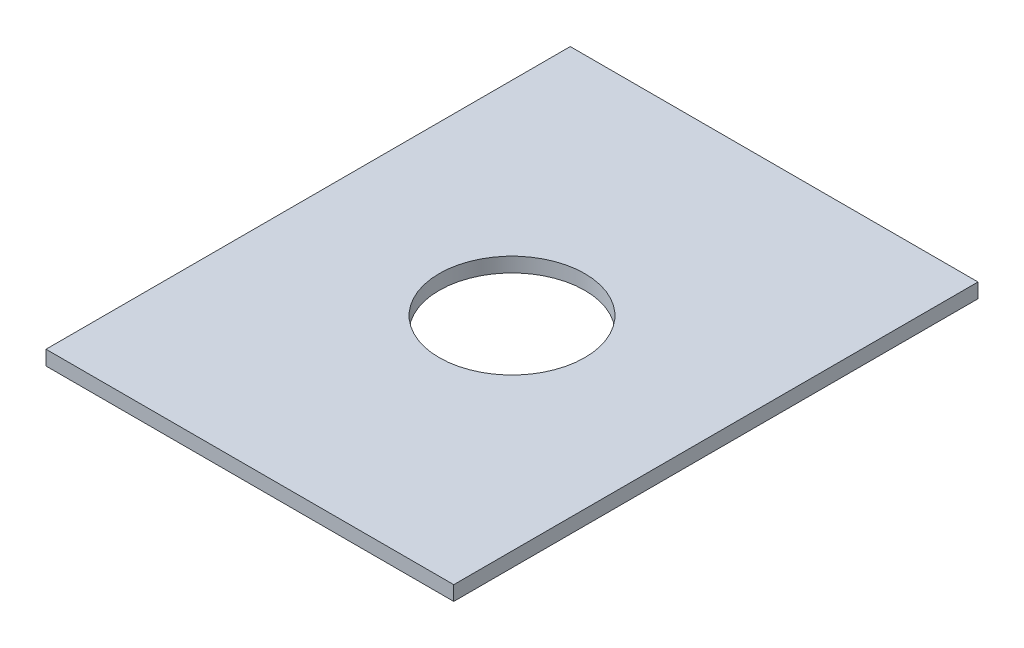
ISO-10303-21;
HEADER;
FILE_DESCRIPTION(('STEP AP214'),'2;1');
FILE_NAME('part.step','',(''),(''),'','','');
FILE_SCHEMA(('AUTOMOTIVE_DESIGN { 1 0 10303 214 1 1 1 1 }'));
ENDSEC;
DATA;
#1=APPLICATION_CONTEXT('core data for automotive mechanical design processes');
#2=APPLICATION_PROTOCOL_DEFINITION('international standard','automotive_design',2000,#1);
#3=PRODUCT_CONTEXT('',#1,'mechanical');
#4=PRODUCT('Part','Part','',(#3));
#5=PRODUCT_RELATED_PRODUCT_CATEGORY('part','',(#4));
#6=PRODUCT_DEFINITION_FORMATION('','',#4);
#7=PRODUCT_DEFINITION_CONTEXT('part definition',#1,'design');
#8=PRODUCT_DEFINITION('design','',#6,#7);
#9=PRODUCT_DEFINITION_SHAPE('','',#8);
#10=(LENGTH_UNIT() NAMED_UNIT(*) SI_UNIT(.MILLI.,.METRE.));
#11=(NAMED_UNIT(*) PLANE_ANGLE_UNIT() SI_UNIT($,.RADIAN.));
#12=(NAMED_UNIT(*) SI_UNIT($,.STERADIAN.) SOLID_ANGLE_UNIT());
#13=UNCERTAINTY_MEASURE_WITH_UNIT(LENGTH_MEASURE(1.E-05),#10,'distance_accuracy_value','');
#14=(GEOMETRIC_REPRESENTATION_CONTEXT(3) GLOBAL_UNCERTAINTY_ASSIGNED_CONTEXT((#13)) GLOBAL_UNIT_ASSIGNED_CONTEXT((#10,
#11,#12)) REPRESENTATION_CONTEXT('',''));
#15=CARTESIAN_POINT('',(0.,0.,0.));
#16=DIRECTION('',(0.,0.,1.));
#17=DIRECTION('',(1.,0.,0.));
#18=AXIS2_PLACEMENT_3D('',#15,#16,#17);
#19=CARTESIAN_POINT('',(70.,5.,-90.));
#20=DIRECTION('',(-1.,0.,0.));
#21=DIRECTION('',(0.,0.,1.));
#22=AXIS2_PLACEMENT_3D('',#19,#20,#21);
#23=PLANE('',#22);
#24=DIRECTION('',(0.,0.,-1.));
#25=VECTOR('',#24,1.);
#26=CARTESIAN_POINT('',(70.,0.,-90.));
#27=LINE('',#26,#25);
#28=CARTESIAN_POINT('',(70.,0.,90.));
#29=VERTEX_POINT('',#28);
#30=CARTESIAN_POINT('',(70.,0.,-90.));
#31=VERTEX_POINT('',#30);
#32=EDGE_CURVE('E115',#29,#31,#27,.T.);
#33=ORIENTED_EDGE('',*,*,#32,.T.);
#34=DIRECTION('',(0.,-1.,0.));
#35=VECTOR('',#34,1.);
#36=CARTESIAN_POINT('',(70.,5.,-90.));
#37=LINE('',#36,#35);
#38=CARTESIAN_POINT('',(70.,5.,-90.));
#39=VERTEX_POINT('',#38);
#40=EDGE_CURVE('E11',#39,#31,#37,.T.);
#41=ORIENTED_EDGE('',*,*,#40,.F.);
#42=DIRECTION('',(0.,0.,-1.));
#43=VECTOR('',#42,1.);
#44=CARTESIAN_POINT('',(70.,5.,-90.));
#45=LINE('',#44,#43);
#46=CARTESIAN_POINT('',(70.,5.,90.));
#47=VERTEX_POINT('',#46);
#48=EDGE_CURVE('E96',#47,#39,#45,.T.);
#49=ORIENTED_EDGE('',*,*,#48,.F.);
#50=DIRECTION('',(0.,-1.,0.));
#51=VECTOR('',#50,1.);
#52=CARTESIAN_POINT('',(70.,5.,90.));
#53=LINE('',#52,#51);
#54=EDGE_CURVE('E107',#47,#29,#53,.T.);
#55=ORIENTED_EDGE('',*,*,#54,.T.);
#56=EDGE_LOOP('',(#33,#41,#49,#55));
#57=FACE_BOUND('',#56,.T.);
#58=ADVANCED_FACE('F42',(#57),#23,.F.);
#59=CARTESIAN_POINT('',(-70.,5.,-90.));
#60=DIRECTION('',(0.,0.,1.));
#61=DIRECTION('',(1.,0.,0.));
#62=AXIS2_PLACEMENT_3D('',#59,#60,#61);
#63=PLANE('',#62);
#64=DIRECTION('',(-1.,0.,0.));
#65=VECTOR('',#64,1.);
#66=CARTESIAN_POINT('',(-70.,0.,-90.));
#67=LINE('',#66,#65);
#68=CARTESIAN_POINT('',(-70.,0.,-90.));
#69=VERTEX_POINT('',#68);
#70=EDGE_CURVE('E101',#31,#69,#67,.T.);
#71=ORIENTED_EDGE('',*,*,#70,.T.);
#72=DIRECTION('',(0.,-1.,0.));
#73=VECTOR('',#72,1.);
#74=CARTESIAN_POINT('',(-70.,5.,-90.));
#75=LINE('',#74,#73);
#76=CARTESIAN_POINT('',(-70.,5.,-90.));
#77=VERTEX_POINT('',#76);
#78=EDGE_CURVE('E52',#77,#69,#75,.T.);
#79=ORIENTED_EDGE('',*,*,#78,.F.);
#80=DIRECTION('',(-1.,0.,0.));
#81=VECTOR('',#80,1.);
#82=CARTESIAN_POINT('',(-70.,5.,-90.));
#83=LINE('',#82,#81);
#84=EDGE_CURVE('E93',#39,#77,#83,.T.);
#85=ORIENTED_EDGE('',*,*,#84,.F.);
#86=ORIENTED_EDGE('',*,*,#40,.T.);
#87=EDGE_LOOP('',(#71,#79,#85,#86));
#88=FACE_BOUND('',#87,.T.);
#89=ADVANCED_FACE('F99',(#88),#63,.F.);
#90=CARTESIAN_POINT('',(-70.,5.,-90.));
#91=DIRECTION('',(1.,0.,0.));
#92=DIRECTION('',(0.,0.,-1.));
#93=AXIS2_PLACEMENT_3D('',#90,#91,#92);
#94=PLANE('',#93);
#95=DIRECTION('',(0.,0.,1.));
#96=VECTOR('',#95,1.);
#97=CARTESIAN_POINT('',(-70.,0.,-90.));
#98=LINE('',#97,#96);
#99=CARTESIAN_POINT('',(-70.,0.,90.));
#100=VERTEX_POINT('',#99);
#101=EDGE_CURVE('E79',#69,#100,#98,.T.);
#102=ORIENTED_EDGE('',*,*,#101,.T.);
#103=DIRECTION('',(0.,-1.,0.));
#104=VECTOR('',#103,1.);
#105=CARTESIAN_POINT('',(-70.,5.,90.));
#106=LINE('',#105,#104);
#107=CARTESIAN_POINT('',(-70.,5.,90.));
#108=VERTEX_POINT('',#107);
#109=EDGE_CURVE('E103',#108,#100,#106,.T.);
#110=ORIENTED_EDGE('',*,*,#109,.F.);
#111=DIRECTION('',(0.,0.,1.));
#112=VECTOR('',#111,1.);
#113=CARTESIAN_POINT('',(-70.,5.,-90.));
#114=LINE('',#113,#112);
#115=EDGE_CURVE('E94',#77,#108,#114,.T.);
#116=ORIENTED_EDGE('',*,*,#115,.F.);
#117=ORIENTED_EDGE('',*,*,#78,.T.);
#118=EDGE_LOOP('',(#102,#110,#116,#117));
#119=FACE_BOUND('',#118,.T.);
#120=ADVANCED_FACE('F102',(#119),#94,.F.);
#121=CARTESIAN_POINT('',(-70.,5.,90.));
#122=DIRECTION('',(0.,0.,-1.));
#123=DIRECTION('',(-1.,0.,0.));
#124=AXIS2_PLACEMENT_3D('',#121,#122,#123);
#125=PLANE('',#124);
#126=DIRECTION('',(1.,0.,0.));
#127=VECTOR('',#126,1.);
#128=CARTESIAN_POINT('',(-70.,0.,90.));
#129=LINE('',#128,#127);
#130=EDGE_CURVE('E82',#100,#29,#129,.T.);
#131=ORIENTED_EDGE('',*,*,#130,.T.);
#132=ORIENTED_EDGE('',*,*,#54,.F.);
#133=DIRECTION('',(1.,0.,0.));
#134=VECTOR('',#133,1.);
#135=CARTESIAN_POINT('',(-70.,5.,90.));
#136=LINE('',#135,#134);
#137=EDGE_CURVE('E62',#108,#47,#136,.T.);
#138=ORIENTED_EDGE('',*,*,#137,.F.);
#139=ORIENTED_EDGE('',*,*,#109,.T.);
#140=EDGE_LOOP('',(#131,#132,#138,#139));
#141=FACE_BOUND('',#140,.T.);
#142=ADVANCED_FACE('F127',(#141),#125,.F.);
#143=CARTESIAN_POINT('',(0.,5.,0.));
#144=DIRECTION('',(0.,1.,0.));
#145=DIRECTION('',(0.,0.,1.));
#146=AXIS2_PLACEMENT_3D('',#143,#144,#145);
#147=PLANE('',#146);
#148=CARTESIAN_POINT('',(0.,5.,0.));
#149=DIRECTION('',(0.,1.,0.));
#150=DIRECTION('',(0.,0.,1.));
#151=AXIS2_PLACEMENT_3D('',#148,#149,#150);
#152=CIRCLE('',#151,25.);
#153=CARTESIAN_POINT('',(0.,5.,25.));
#154=VERTEX_POINT('',#153);
#155=EDGE_CURVE('E134',#154,#154,#152,.T.);
#156=ORIENTED_EDGE('',*,*,#155,.F.);
#157=EDGE_LOOP('',(#156));
#158=FACE_BOUND('',#157,.T.);
#159=ORIENTED_EDGE('',*,*,#48,.T.);
#160=ORIENTED_EDGE('',*,*,#84,.T.);
#161=ORIENTED_EDGE('',*,*,#115,.T.);
#162=ORIENTED_EDGE('',*,*,#137,.T.);
#163=EDGE_LOOP('',(#159,#160,#161,#162));
#164=FACE_BOUND('',#163,.T.);
#165=ADVANCED_FACE('F95',(#158,#164),#147,.T.);
#166=CARTESIAN_POINT('',(0.,0.,0.));
#167=DIRECTION('',(0.,1.,0.));
#168=DIRECTION('',(0.,0.,1.));
#169=AXIS2_PLACEMENT_3D('',#166,#167,#168);
#170=PLANE('',#169);
#171=CARTESIAN_POINT('',(0.,0.,0.));
#172=DIRECTION('',(0.,1.,0.));
#173=DIRECTION('',(0.,0.,1.));
#174=AXIS2_PLACEMENT_3D('',#171,#172,#173);
#175=CIRCLE('',#174,25.);
#176=CARTESIAN_POINT('',(0.,0.,25.));
#177=VERTEX_POINT('',#176);
#178=EDGE_CURVE('E117',#177,#177,#175,.T.);
#179=ORIENTED_EDGE('',*,*,#178,.T.);
#180=EDGE_LOOP('',(#179));
#181=FACE_BOUND('',#180,.T.);
#182=ORIENTED_EDGE('',*,*,#32,.F.);
#183=ORIENTED_EDGE('',*,*,#130,.F.);
#184=ORIENTED_EDGE('',*,*,#101,.F.);
#185=ORIENTED_EDGE('',*,*,#70,.F.);
#186=EDGE_LOOP('',(#182,#183,#184,#185));
#187=FACE_BOUND('',#186,.T.);
#188=ADVANCED_FACE('F129',(#181,#187),#170,.F.);
#189=CARTESIAN_POINT('',(0.,0.,0.));
#190=DIRECTION('',(0.,1.,0.));
#191=DIRECTION('',(0.,0.,1.));
#192=AXIS2_PLACEMENT_3D('',#189,#190,#191);
#193=CYLINDRICAL_SURFACE('',#192,25.);
#194=ORIENTED_EDGE('',*,*,#178,.F.);
#195=EDGE_LOOP('',(#194));
#196=FACE_BOUND('',#195,.T.);
#197=ORIENTED_EDGE('',*,*,#155,.T.);
#198=EDGE_LOOP('',(#197));
#199=FACE_BOUND('',#198,.T.);
#200=ADVANCED_FACE('F142',(#196,#199),#193,.F.);
#201=CLOSED_SHELL('',(#58,#89,#120,#142,#165,#188,#200));
#202=MANIFOLD_SOLID_BREP('B2',#201);
#203=ADVANCED_BREP_SHAPE_REPRESENTATION('',(#18,#202),#14);
#204=SHAPE_DEFINITION_REPRESENTATION(#9,#203);
ENDSEC;
END-ISO-10303-21;
